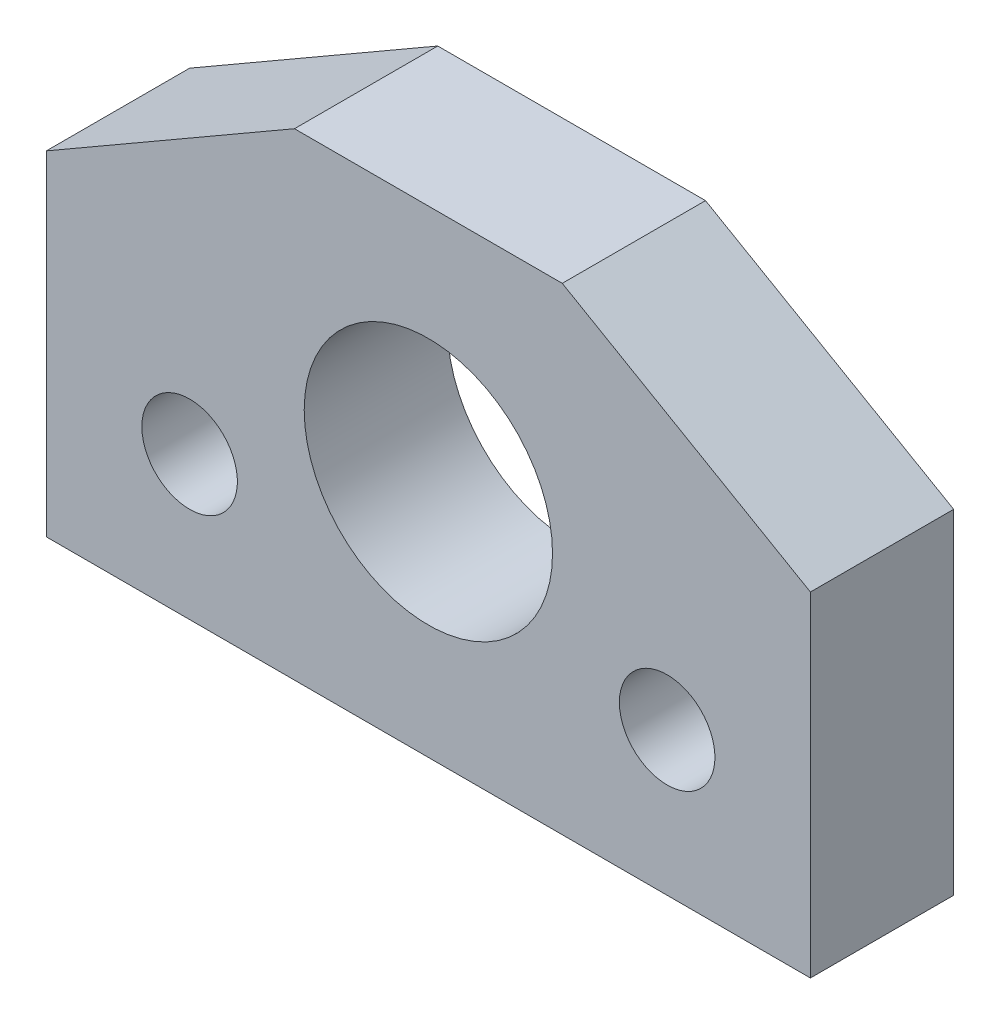
ISO-10303-21;
HEADER;
FILE_DESCRIPTION(('STEP AP214'),'2;1');
FILE_NAME('part.step','',(''),(''),'','','');
FILE_SCHEMA(('AUTOMOTIVE_DESIGN { 1 0 10303 214 1 1 1 1 }'));
ENDSEC;
DATA;
#1=APPLICATION_CONTEXT('core data for automotive mechanical design processes');
#2=APPLICATION_PROTOCOL_DEFINITION('international standard','automotive_design',2000,#1);
#3=PRODUCT_CONTEXT('',#1,'mechanical');
#4=PRODUCT('Part','Part','',(#3));
#5=PRODUCT_RELATED_PRODUCT_CATEGORY('part','',(#4));
#6=PRODUCT_DEFINITION_FORMATION('','',#4);
#7=PRODUCT_DEFINITION_CONTEXT('part definition',#1,'design');
#8=PRODUCT_DEFINITION('design','',#6,#7);
#9=PRODUCT_DEFINITION_SHAPE('','',#8);
#10=(LENGTH_UNIT() NAMED_UNIT(*) SI_UNIT(.MILLI.,.METRE.));
#11=(NAMED_UNIT(*) PLANE_ANGLE_UNIT() SI_UNIT($,.RADIAN.));
#12=(NAMED_UNIT(*) SI_UNIT($,.STERADIAN.) SOLID_ANGLE_UNIT());
#13=UNCERTAINTY_MEASURE_WITH_UNIT(LENGTH_MEASURE(1.E-05),#10,'distance_accuracy_value','');
#14=(GEOMETRIC_REPRESENTATION_CONTEXT(3) GLOBAL_UNCERTAINTY_ASSIGNED_CONTEXT((#13)) GLOBAL_UNIT_ASSIGNED_CONTEXT((#10,
#11,#12)) REPRESENTATION_CONTEXT('',''));
#15=CARTESIAN_POINT('',(0.,0.,0.));
#16=DIRECTION('',(0.,0.,1.));
#17=DIRECTION('',(1.,0.,0.));
#18=AXIS2_PLACEMENT_3D('',#15,#16,#17);
#19=CARTESIAN_POINT('',(0.,44.45,19.05));
#20=DIRECTION('',(1.,0.,0.));
#21=DIRECTION('',(0.,1.,0.));
#22=AXIS2_PLACEMENT_3D('',#19,#20,#21);
#23=PLANE('',#22);
#24=DIRECTION('',(0.,-1.,0.));
#25=VECTOR('',#24,1.);
#26=CARTESIAN_POINT('',(0.,44.45,0.));
#27=LINE('',#26,#25);
#28=CARTESIAN_POINT('',(0.,44.45,0.));
#29=VERTEX_POINT('',#28);
#30=CARTESIAN_POINT('',(0.,0.,0.));
#31=VERTEX_POINT('',#30);
#32=EDGE_CURVE('E133',#29,#31,#27,.T.);
#33=ORIENTED_EDGE('',*,*,#32,.T.);
#34=DIRECTION('',(0.,0.,-1.));
#35=VECTOR('',#34,1.);
#36=CARTESIAN_POINT('',(0.,0.,19.05));
#37=LINE('',#36,#35);
#38=CARTESIAN_POINT('',(0.,0.,19.05));
#39=VERTEX_POINT('',#38);
#40=EDGE_CURVE('E11',#39,#31,#37,.T.);
#41=ORIENTED_EDGE('',*,*,#40,.F.);
#42=DIRECTION('',(0.,-1.,0.));
#43=VECTOR('',#42,1.);
#44=CARTESIAN_POINT('',(0.,44.45,19.05));
#45=LINE('',#44,#43);
#46=CARTESIAN_POINT('',(0.,44.45,19.05));
#47=VERTEX_POINT('',#46);
#48=EDGE_CURVE('E149',#47,#39,#45,.T.);
#49=ORIENTED_EDGE('',*,*,#48,.F.);
#50=DIRECTION('',(0.,0.,-1.));
#51=VECTOR('',#50,1.);
#52=CARTESIAN_POINT('',(0.,44.45,19.05));
#53=LINE('',#52,#51);
#54=EDGE_CURVE('E129',#47,#29,#53,.T.);
#55=ORIENTED_EDGE('',*,*,#54,.T.);
#56=EDGE_LOOP('',(#33,#41,#49,#55));
#57=FACE_BOUND('',#56,.T.);
#58=ADVANCED_FACE('F41',(#57),#23,.F.);
#59=CARTESIAN_POINT('',(0.,0.,19.05));
#60=DIRECTION('',(0.,1.,0.));
#61=DIRECTION('',(0.,0.,1.));
#62=AXIS2_PLACEMENT_3D('',#59,#60,#61);
#63=PLANE('',#62);
#64=DIRECTION('',(1.,0.,0.));
#65=VECTOR('',#64,1.);
#66=CARTESIAN_POINT('',(0.,0.,0.));
#67=LINE('',#66,#65);
#68=CARTESIAN_POINT('',(101.6,0.,0.));
#69=VERTEX_POINT('',#68);
#70=EDGE_CURVE('E137',#31,#69,#67,.T.);
#71=ORIENTED_EDGE('',*,*,#70,.T.);
#72=DIRECTION('',(0.,0.,-1.));
#73=VECTOR('',#72,1.);
#74=CARTESIAN_POINT('',(101.6,0.,19.05));
#75=LINE('',#74,#73);
#76=CARTESIAN_POINT('',(101.6,0.,19.05));
#77=VERTEX_POINT('',#76);
#78=EDGE_CURVE('E51',#77,#69,#75,.T.);
#79=ORIENTED_EDGE('',*,*,#78,.F.);
#80=DIRECTION('',(1.,0.,0.));
#81=VECTOR('',#80,1.);
#82=CARTESIAN_POINT('',(0.,0.,19.05));
#83=LINE('',#82,#81);
#84=EDGE_CURVE('E97',#39,#77,#83,.T.);
#85=ORIENTED_EDGE('',*,*,#84,.F.);
#86=ORIENTED_EDGE('',*,*,#40,.T.);
#87=EDGE_LOOP('',(#71,#79,#85,#86));
#88=FACE_BOUND('',#87,.T.);
#89=ADVANCED_FACE('F200',(#88),#63,.F.);
#90=CARTESIAN_POINT('',(101.6,0.,19.05));
#91=DIRECTION('',(-1.,0.,0.));
#92=DIRECTION('',(0.,0.,1.));
#93=AXIS2_PLACEMENT_3D('',#90,#91,#92);
#94=PLANE('',#93);
#95=DIRECTION('',(0.,1.,0.));
#96=VECTOR('',#95,1.);
#97=CARTESIAN_POINT('',(101.6,0.,0.));
#98=LINE('',#97,#96);
#99=CARTESIAN_POINT('',(101.6,44.45,0.));
#100=VERTEX_POINT('',#99);
#101=EDGE_CURVE('E140',#69,#100,#98,.T.);
#102=ORIENTED_EDGE('',*,*,#101,.T.);
#103=DIRECTION('',(0.,0.,-1.));
#104=VECTOR('',#103,1.);
#105=CARTESIAN_POINT('',(101.6,44.45,19.05));
#106=LINE('',#105,#104);
#107=CARTESIAN_POINT('',(101.6,44.45,19.05));
#108=VERTEX_POINT('',#107);
#109=EDGE_CURVE('E121',#108,#100,#106,.T.);
#110=ORIENTED_EDGE('',*,*,#109,.F.);
#111=DIRECTION('',(0.,1.,0.));
#112=VECTOR('',#111,1.);
#113=CARTESIAN_POINT('',(101.6,0.,19.05));
#114=LINE('',#113,#112);
#115=EDGE_CURVE('E110',#77,#108,#114,.T.);
#116=ORIENTED_EDGE('',*,*,#115,.F.);
#117=ORIENTED_EDGE('',*,*,#78,.T.);
#118=EDGE_LOOP('',(#102,#110,#116,#117));
#119=FACE_BOUND('',#118,.T.);
#120=ADVANCED_FACE('F204',(#119),#94,.F.);
#121=CARTESIAN_POINT('',(101.6,44.45,19.05));
#122=DIRECTION('',(-0.5,-0.866025403784439,0.));
#123=DIRECTION('',(0.866025403784439,-0.5,0.));
#124=AXIS2_PLACEMENT_3D('',#121,#122,#123);
#125=PLANE('',#124);
#126=DIRECTION('',(-0.866025403784439,0.5,0.));
#127=VECTOR('',#126,1.);
#128=CARTESIAN_POINT('',(101.6,44.45,0.));
#129=LINE('',#128,#127);
#130=CARTESIAN_POINT('',(68.6044321158129,63.5,0.));
#131=VERTEX_POINT('',#130);
#132=EDGE_CURVE('E119',#100,#131,#129,.T.);
#133=ORIENTED_EDGE('',*,*,#132,.T.);
#134=DIRECTION('',(0.,0.,-1.));
#135=VECTOR('',#134,1.);
#136=CARTESIAN_POINT('',(68.6044321158129,63.5,19.05));
#137=LINE('',#136,#135);
#138=CARTESIAN_POINT('',(68.6044321158129,63.5,19.05));
#139=VERTEX_POINT('',#138);
#140=EDGE_CURVE('E116',#139,#131,#137,.T.);
#141=ORIENTED_EDGE('',*,*,#140,.F.);
#142=DIRECTION('',(-0.866025403784439,0.5,0.));
#143=VECTOR('',#142,1.);
#144=CARTESIAN_POINT('',(101.6,44.45,19.05));
#145=LINE('',#144,#143);
#146=EDGE_CURVE('E104',#108,#139,#145,.T.);
#147=ORIENTED_EDGE('',*,*,#146,.F.);
#148=ORIENTED_EDGE('',*,*,#109,.T.);
#149=EDGE_LOOP('',(#133,#141,#147,#148));
#150=FACE_BOUND('',#149,.T.);
#151=ADVANCED_FACE('F117',(#150),#125,.F.);
#152=CARTESIAN_POINT('',(68.6044321158129,63.5,19.05));
#153=DIRECTION('',(0.,-1.,0.));
#154=DIRECTION('',(1.,0.,0.));
#155=AXIS2_PLACEMENT_3D('',#152,#153,#154);
#156=PLANE('',#155);
#157=DIRECTION('',(-1.,0.,0.));
#158=VECTOR('',#157,1.);
#159=CARTESIAN_POINT('',(68.6044321158129,63.5,0.));
#160=LINE('',#159,#158);
#161=CARTESIAN_POINT('',(32.9955678841871,63.5,0.));
#162=VERTEX_POINT('',#161);
#163=EDGE_CURVE('E83',#131,#162,#160,.T.);
#164=ORIENTED_EDGE('',*,*,#163,.T.);
#165=DIRECTION('',(0.,0.,-1.));
#166=VECTOR('',#165,1.);
#167=CARTESIAN_POINT('',(32.9955678841871,63.5,19.05));
#168=LINE('',#167,#166);
#169=CARTESIAN_POINT('',(32.9955678841871,63.5,19.05));
#170=VERTEX_POINT('',#169);
#171=EDGE_CURVE('E122',#170,#162,#168,.T.);
#172=ORIENTED_EDGE('',*,*,#171,.F.);
#173=DIRECTION('',(-1.,0.,0.));
#174=VECTOR('',#173,1.);
#175=CARTESIAN_POINT('',(68.6044321158129,63.5,19.05));
#176=LINE('',#175,#174);
#177=EDGE_CURVE('E108',#139,#170,#176,.T.);
#178=ORIENTED_EDGE('',*,*,#177,.F.);
#179=ORIENTED_EDGE('',*,*,#140,.T.);
#180=EDGE_LOOP('',(#164,#172,#178,#179));
#181=FACE_BOUND('',#180,.T.);
#182=ADVANCED_FACE('F124',(#181),#156,.F.);
#183=CARTESIAN_POINT('',(32.9955678841871,63.5,19.05));
#184=DIRECTION('',(0.499999999999999,-0.866025403784439,0.));
#185=DIRECTION('',(0.866025403784439,0.5,0.));
#186=AXIS2_PLACEMENT_3D('',#183,#184,#185);
#187=PLANE('',#186);
#188=DIRECTION('',(-0.866025403784439,-0.499999999999999,0.));
#189=VECTOR('',#188,1.);
#190=CARTESIAN_POINT('',(32.9955678841871,63.5,0.));
#191=LINE('',#190,#189);
#192=EDGE_CURVE('E89',#162,#29,#191,.T.);
#193=ORIENTED_EDGE('',*,*,#192,.T.);
#194=ORIENTED_EDGE('',*,*,#54,.F.);
#195=DIRECTION('',(-0.866025403784439,-0.499999999999999,0.));
#196=VECTOR('',#195,1.);
#197=CARTESIAN_POINT('',(32.9955678841871,63.5,19.05));
#198=LINE('',#197,#196);
#199=EDGE_CURVE('E60',#170,#47,#198,.T.);
#200=ORIENTED_EDGE('',*,*,#199,.F.);
#201=ORIENTED_EDGE('',*,*,#171,.T.);
#202=EDGE_LOOP('',(#193,#194,#200,#201));
#203=FACE_BOUND('',#202,.T.);
#204=ADVANCED_FACE('F189',(#203),#187,.F.);
#205=CARTESIAN_POINT('',(0.,0.,19.05));
#206=DIRECTION('',(0.,0.,1.));
#207=DIRECTION('',(1.,0.,0.));
#208=AXIS2_PLACEMENT_3D('',#205,#206,#207);
#209=PLANE('',#208);
#210=CARTESIAN_POINT('',(19.05,19.05,19.05));
#211=DIRECTION('',(0.,0.,1.));
#212=DIRECTION('',(1.,0.,0.));
#213=AXIS2_PLACEMENT_3D('',#210,#211,#212);
#214=CIRCLE('',#213,6.35);
#215=CARTESIAN_POINT('',(12.7,19.05,19.05));
#216=VERTEX_POINT('',#215);
#217=EDGE_CURVE('E163',#216,#216,#214,.T.);
#218=ORIENTED_EDGE('',*,*,#217,.F.);
#219=EDGE_LOOP('',(#218));
#220=FACE_BOUND('',#219,.T.);
#221=CARTESIAN_POINT('',(82.55,19.05,19.05));
#222=DIRECTION('',(0.,0.,1.));
#223=DIRECTION('',(1.,0.,0.));
#224=AXIS2_PLACEMENT_3D('',#221,#222,#223);
#225=CIRCLE('',#224,6.35);
#226=CARTESIAN_POINT('',(76.2,19.05,19.05));
#227=VERTEX_POINT('',#226);
#228=EDGE_CURVE('E307',#227,#227,#225,.T.);
#229=ORIENTED_EDGE('',*,*,#228,.F.);
#230=EDGE_LOOP('',(#229));
#231=FACE_BOUND('',#230,.T.);
#232=CARTESIAN_POINT('',(50.8,31.75,19.05));
#233=DIRECTION('',(0.,0.,1.));
#234=DIRECTION('',(1.,0.,0.));
#235=AXIS2_PLACEMENT_3D('',#232,#233,#234);
#236=CIRCLE('',#235,16.51);
#237=CARTESIAN_POINT('',(34.29,31.75,19.05));
#238=VERTEX_POINT('',#237);
#239=EDGE_CURVE('E312',#238,#238,#236,.T.);
#240=ORIENTED_EDGE('',*,*,#239,.F.);
#241=EDGE_LOOP('',(#240));
#242=FACE_BOUND('',#241,.T.);
#243=ORIENTED_EDGE('',*,*,#48,.T.);
#244=ORIENTED_EDGE('',*,*,#84,.T.);
#245=ORIENTED_EDGE('',*,*,#115,.T.);
#246=ORIENTED_EDGE('',*,*,#146,.T.);
#247=ORIENTED_EDGE('',*,*,#177,.T.);
#248=ORIENTED_EDGE('',*,*,#199,.T.);
#249=EDGE_LOOP('',(#243,#244,#245,#246,#247,#248));
#250=FACE_BOUND('',#249,.T.);
#251=ADVANCED_FACE('F106',(#220,#231,#242,#250),#209,.T.);
#252=CARTESIAN_POINT('',(0.,0.,0.));
#253=DIRECTION('',(0.,0.,1.));
#254=DIRECTION('',(1.,0.,0.));
#255=AXIS2_PLACEMENT_3D('',#252,#253,#254);
#256=PLANE('',#255);
#257=CARTESIAN_POINT('',(19.05,19.05,0.));
#258=DIRECTION('',(0.,0.,1.));
#259=DIRECTION('',(1.,0.,0.));
#260=AXIS2_PLACEMENT_3D('',#257,#258,#259);
#261=CIRCLE('',#260,6.35);
#262=CARTESIAN_POINT('',(12.7,19.05,0.));
#263=VERTEX_POINT('',#262);
#264=EDGE_CURVE('E44',#263,#263,#261,.F.);
#265=ORIENTED_EDGE('',*,*,#264,.F.);
#266=EDGE_LOOP('',(#265));
#267=FACE_BOUND('',#266,.T.);
#268=CARTESIAN_POINT('',(82.55,19.05,0.));
#269=DIRECTION('',(0.,0.,1.));
#270=DIRECTION('',(1.,0.,0.));
#271=AXIS2_PLACEMENT_3D('',#268,#269,#270);
#272=CIRCLE('',#271,6.35);
#273=CARTESIAN_POINT('',(76.2,19.05,0.));
#274=VERTEX_POINT('',#273);
#275=EDGE_CURVE('E162',#274,#274,#272,.F.);
#276=ORIENTED_EDGE('',*,*,#275,.F.);
#277=EDGE_LOOP('',(#276));
#278=FACE_BOUND('',#277,.T.);
#279=CARTESIAN_POINT('',(50.8,31.75,0.));
#280=DIRECTION('',(0.,0.,1.));
#281=DIRECTION('',(1.,0.,0.));
#282=AXIS2_PLACEMENT_3D('',#279,#280,#281);
#283=CIRCLE('',#282,16.51);
#284=CARTESIAN_POINT('',(34.29,31.75,0.));
#285=VERTEX_POINT('',#284);
#286=EDGE_CURVE('E159',#285,#285,#283,.F.);
#287=ORIENTED_EDGE('',*,*,#286,.F.);
#288=EDGE_LOOP('',(#287));
#289=FACE_BOUND('',#288,.T.);
#290=ORIENTED_EDGE('',*,*,#32,.F.);
#291=ORIENTED_EDGE('',*,*,#192,.F.);
#292=ORIENTED_EDGE('',*,*,#163,.F.);
#293=ORIENTED_EDGE('',*,*,#132,.F.);
#294=ORIENTED_EDGE('',*,*,#101,.F.);
#295=ORIENTED_EDGE('',*,*,#70,.F.);
#296=EDGE_LOOP('',(#290,#291,#292,#293,#294,#295));
#297=FACE_BOUND('',#296,.T.);
#298=ADVANCED_FACE('F176',(#267,#278,#289,#297),#256,.F.);
#299=CARTESIAN_POINT('',(50.8,31.75,19.05));
#300=DIRECTION('',(0.,0.,-1.));
#301=DIRECTION('',(-1.,0.,0.));
#302=AXIS2_PLACEMENT_3D('',#299,#300,#301);
#303=CYLINDRICAL_SURFACE('',#302,16.51);
#304=CARTESIAN_POINT('',(34.29,31.75,19.05));
#305=CARTESIAN_POINT('',(34.29,31.75,18.8515625));
#306=CARTESIAN_POINT('',(34.29,31.75,18.653125));
#307=CARTESIAN_POINT('',(34.29,31.75,18.25625));
#308=CARTESIAN_POINT('',(34.29,31.75,18.0578125));
#309=CARTESIAN_POINT('',(34.29,31.75,17.6609375));
#310=CARTESIAN_POINT('',(34.29,31.75,17.4625));
#311=CARTESIAN_POINT('',(34.29,31.75,17.065625));
#312=CARTESIAN_POINT('',(34.29,31.75,16.8671875));
#313=CARTESIAN_POINT('',(34.29,31.75,16.4703125));
#314=CARTESIAN_POINT('',(34.29,31.75,16.271875));
#315=CARTESIAN_POINT('',(34.29,31.75,15.875));
#316=CARTESIAN_POINT('',(34.29,31.75,15.6765625));
#317=CARTESIAN_POINT('',(34.29,31.75,15.2796875));
#318=CARTESIAN_POINT('',(34.29,31.75,15.08125));
#319=CARTESIAN_POINT('',(34.29,31.75,14.684375));
#320=CARTESIAN_POINT('',(34.29,31.75,14.4859375));
#321=CARTESIAN_POINT('',(34.29,31.75,14.0890625));
#322=CARTESIAN_POINT('',(34.29,31.75,13.890625));
#323=CARTESIAN_POINT('',(34.29,31.75,13.49375));
#324=CARTESIAN_POINT('',(34.29,31.75,13.2953125));
#325=CARTESIAN_POINT('',(34.29,31.75,12.8984375));
#326=CARTESIAN_POINT('',(34.29,31.75,12.7));
#327=CARTESIAN_POINT('',(34.29,31.75,12.303125));
#328=CARTESIAN_POINT('',(34.29,31.75,12.1046875));
#329=CARTESIAN_POINT('',(34.29,31.75,11.7078125));
#330=CARTESIAN_POINT('',(34.29,31.75,11.509375));
#331=CARTESIAN_POINT('',(34.29,31.75,11.1125));
#332=CARTESIAN_POINT('',(34.29,31.75,10.9140625));
#333=CARTESIAN_POINT('',(34.29,31.75,10.5171875));
#334=CARTESIAN_POINT('',(34.29,31.75,10.31875));
#335=CARTESIAN_POINT('',(34.29,31.75,9.921875));
#336=CARTESIAN_POINT('',(34.29,31.75,9.7234375));
#337=CARTESIAN_POINT('',(34.29,31.75,9.3265625));
#338=CARTESIAN_POINT('',(34.29,31.75,9.128125));
#339=CARTESIAN_POINT('',(34.29,31.75,8.73125));
#340=CARTESIAN_POINT('',(34.29,31.75,8.5328125));
#341=CARTESIAN_POINT('',(34.29,31.75,8.1359375));
#342=CARTESIAN_POINT('',(34.29,31.75,7.9375));
#343=CARTESIAN_POINT('',(34.29,31.75,7.540625));
#344=CARTESIAN_POINT('',(34.29,31.75,7.3421875));
#345=CARTESIAN_POINT('',(34.29,31.75,6.9453125));
#346=CARTESIAN_POINT('',(34.29,31.75,6.746875));
#347=CARTESIAN_POINT('',(34.29,31.75,6.35));
#348=CARTESIAN_POINT('',(34.29,31.75,6.1515625));
#349=CARTESIAN_POINT('',(34.29,31.75,5.7546875));
#350=CARTESIAN_POINT('',(34.29,31.75,5.55625));
#351=CARTESIAN_POINT('',(34.29,31.75,5.159375));
#352=CARTESIAN_POINT('',(34.29,31.75,4.9609375));
#353=CARTESIAN_POINT('',(34.29,31.75,4.5640625));
#354=CARTESIAN_POINT('',(34.29,31.75,4.365625));
#355=CARTESIAN_POINT('',(34.29,31.75,3.96875));
#356=CARTESIAN_POINT('',(34.29,31.75,3.7703125));
#357=CARTESIAN_POINT('',(34.29,31.75,3.3734375));
#358=CARTESIAN_POINT('',(34.29,31.75,3.175));
#359=CARTESIAN_POINT('',(34.29,31.75,2.778125));
#360=CARTESIAN_POINT('',(34.29,31.75,2.5796875));
#361=CARTESIAN_POINT('',(34.29,31.75,2.1828125));
#362=CARTESIAN_POINT('',(34.29,31.75,1.984375));
#363=CARTESIAN_POINT('',(34.29,31.75,1.5875));
#364=CARTESIAN_POINT('',(34.29,31.75,1.3890625));
#365=CARTESIAN_POINT('',(34.29,31.75,0.992187500000001));
#366=CARTESIAN_POINT('',(34.29,31.75,0.793750000000001));
#367=CARTESIAN_POINT('',(34.29,31.75,0.396875));
#368=CARTESIAN_POINT('',(34.29,31.75,0.1984375));
#369=CARTESIAN_POINT('',(34.29,31.75,0.));
#370=B_SPLINE_CURVE_WITH_KNOTS('',3,(#304,#305,#306,#307,#308,#309,#310,#311,#312,#313,#314,
#315,#316,#317,#318,#319,#320,#321,#322,#323,#324,#325,#326,#327,#328,#329,#330,#331,#332,#333,
#334,#335,#336,#337,#338,#339,#340,#341,#342,#343,#344,#345,#346,#347,#348,#349,#350,#351,#352,
#353,#354,#355,#356,#357,#358,#359,#360,#361,#362,#363,#364,#365,#366,#367,#368,#369),
.UNSPECIFIED.,.F.,.F.,(4,2,2,2,2,2,2,2,2,2,2,2,2,2,2,2,2,2,2,2,2,2,2,2,2,2,2,2,2,2,2,2,4),(0.,
0.595312499999997,1.190625,1.7859375,2.38125,2.9765625,3.571875,4.1671875,4.7625,5.3578125,
5.953125,6.5484375,7.14375,7.7390625,8.334375,8.9296875,9.525,10.1203125,10.715625,11.3109375,
11.90625,12.5015625,13.096875,13.6921875,14.2875,14.8828125,15.478125,16.0734375,16.66875,
17.2640625,17.859375,18.4546875,19.05),.UNSPECIFIED.);
#371=EDGE_CURVE('BSEAM179',#238,#285,#370,.T.);
#372=ORIENTED_EDGE('',*,*,#239,.T.);
#373=ORIENTED_EDGE('',*,*,#286,.T.);
#374=ORIENTED_EDGE('',*,*,#371,.T.);
#375=ORIENTED_EDGE('',*,*,#371,.F.);
#376=EDGE_LOOP('',(#372,#374,#373,#375));
#377=FACE_BOUND('',#376,.T.);
#378=ADVANCED_FACE('F179',(#377),#303,.F.);
#379=CARTESIAN_POINT('',(82.55,19.05,19.05));
#380=DIRECTION('',(0.,0.,-1.));
#381=DIRECTION('',(-1.,0.,0.));
#382=AXIS2_PLACEMENT_3D('',#379,#380,#381);
#383=CYLINDRICAL_SURFACE('',#382,6.35);
#384=CARTESIAN_POINT('',(76.2,19.05,19.05));
#385=CARTESIAN_POINT('',(76.2,19.05,18.8515625));
#386=CARTESIAN_POINT('',(76.2,19.05,18.653125));
#387=CARTESIAN_POINT('',(76.2,19.05,18.25625));
#388=CARTESIAN_POINT('',(76.2,19.05,18.0578125));
#389=CARTESIAN_POINT('',(76.2,19.05,17.6609375));
#390=CARTESIAN_POINT('',(76.2,19.05,17.4625));
#391=CARTESIAN_POINT('',(76.2,19.05,17.065625));
#392=CARTESIAN_POINT('',(76.2,19.05,16.8671875));
#393=CARTESIAN_POINT('',(76.2,19.05,16.4703125));
#394=CARTESIAN_POINT('',(76.2,19.05,16.271875));
#395=CARTESIAN_POINT('',(76.2,19.05,15.875));
#396=CARTESIAN_POINT('',(76.2,19.05,15.6765625));
#397=CARTESIAN_POINT('',(76.2,19.05,15.2796875));
#398=CARTESIAN_POINT('',(76.2,19.05,15.08125));
#399=CARTESIAN_POINT('',(76.2,19.05,14.684375));
#400=CARTESIAN_POINT('',(76.2,19.05,14.4859375));
#401=CARTESIAN_POINT('',(76.2,19.05,14.0890625));
#402=CARTESIAN_POINT('',(76.2,19.05,13.890625));
#403=CARTESIAN_POINT('',(76.2,19.05,13.49375));
#404=CARTESIAN_POINT('',(76.2,19.05,13.2953125));
#405=CARTESIAN_POINT('',(76.2,19.05,12.8984375));
#406=CARTESIAN_POINT('',(76.2,19.05,12.7));
#407=CARTESIAN_POINT('',(76.2,19.05,12.303125));
#408=CARTESIAN_POINT('',(76.2,19.05,12.1046875));
#409=CARTESIAN_POINT('',(76.2,19.05,11.7078125));
#410=CARTESIAN_POINT('',(76.2,19.05,11.509375));
#411=CARTESIAN_POINT('',(76.2,19.05,11.1125));
#412=CARTESIAN_POINT('',(76.2,19.05,10.9140625));
#413=CARTESIAN_POINT('',(76.2,19.05,10.5171875));
#414=CARTESIAN_POINT('',(76.2,19.05,10.31875));
#415=CARTESIAN_POINT('',(76.2,19.05,9.921875));
#416=CARTESIAN_POINT('',(76.2,19.05,9.7234375));
#417=CARTESIAN_POINT('',(76.2,19.05,9.3265625));
#418=CARTESIAN_POINT('',(76.2,19.05,9.128125));
#419=CARTESIAN_POINT('',(76.2,19.05,8.73125));
#420=CARTESIAN_POINT('',(76.2,19.05,8.5328125));
#421=CARTESIAN_POINT('',(76.2,19.05,8.1359375));
#422=CARTESIAN_POINT('',(76.2,19.05,7.9375));
#423=CARTESIAN_POINT('',(76.2,19.05,7.540625));
#424=CARTESIAN_POINT('',(76.2,19.05,7.3421875));
#425=CARTESIAN_POINT('',(76.2,19.05,6.9453125));
#426=CARTESIAN_POINT('',(76.2,19.05,6.746875));
#427=CARTESIAN_POINT('',(76.2,19.05,6.35));
#428=CARTESIAN_POINT('',(76.2,19.05,6.1515625));
#429=CARTESIAN_POINT('',(76.2,19.05,5.7546875));
#430=CARTESIAN_POINT('',(76.2,19.05,5.55625));
#431=CARTESIAN_POINT('',(76.2,19.05,5.159375));
#432=CARTESIAN_POINT('',(76.2,19.05,4.9609375));
#433=CARTESIAN_POINT('',(76.2,19.05,4.5640625));
#434=CARTESIAN_POINT('',(76.2,19.05,4.365625));
#435=CARTESIAN_POINT('',(76.2,19.05,3.96875));
#436=CARTESIAN_POINT('',(76.2,19.05,3.7703125));
#437=CARTESIAN_POINT('',(76.2,19.05,3.3734375));
#438=CARTESIAN_POINT('',(76.2,19.05,3.175));
#439=CARTESIAN_POINT('',(76.2,19.05,2.778125));
#440=CARTESIAN_POINT('',(76.2,19.05,2.5796875));
#441=CARTESIAN_POINT('',(76.2,19.05,2.1828125));
#442=CARTESIAN_POINT('',(76.2,19.05,1.984375));
#443=CARTESIAN_POINT('',(76.2,19.05,1.5875));
#444=CARTESIAN_POINT('',(76.2,19.05,1.3890625));
#445=CARTESIAN_POINT('',(76.2,19.05,0.992187500000001));
#446=CARTESIAN_POINT('',(76.2,19.05,0.793750000000001));
#447=CARTESIAN_POINT('',(76.2,19.05,0.396875));
#448=CARTESIAN_POINT('',(76.2,19.05,0.1984375));
#449=CARTESIAN_POINT('',(76.2,19.05,0.));
#450=B_SPLINE_CURVE_WITH_KNOTS('',3,(#384,#385,#386,#387,#388,#389,#390,#391,#392,#393,#394,
#395,#396,#397,#398,#399,#400,#401,#402,#403,#404,#405,#406,#407,#408,#409,#410,#411,#412,#413,
#414,#415,#416,#417,#418,#419,#420,#421,#422,#423,#424,#425,#426,#427,#428,#429,#430,#431,#432,
#433,#434,#435,#436,#437,#438,#439,#440,#441,#442,#443,#444,#445,#446,#447,#448,#449),
.UNSPECIFIED.,.F.,.F.,(4,2,2,2,2,2,2,2,2,2,2,2,2,2,2,2,2,2,2,2,2,2,2,2,2,2,2,2,2,2,2,2,4),(0.,
0.5953125,1.190625,1.7859375,2.38125,2.9765625,3.571875,4.1671875,4.7625,5.3578125,5.953125,
6.5484375,7.14375,7.7390625,8.334375,8.9296875,9.525,10.1203125,10.715625,11.3109375,11.90625,
12.5015625,13.096875,13.6921875,14.2875,14.8828125,15.478125,16.0734375,16.66875,17.2640625,
17.859375,18.4546875,19.05),.UNSPECIFIED.);
#451=EDGE_CURVE('BSEAM245',#227,#274,#450,.T.);
#452=ORIENTED_EDGE('',*,*,#228,.T.);
#453=ORIENTED_EDGE('',*,*,#275,.T.);
#454=ORIENTED_EDGE('',*,*,#451,.T.);
#455=ORIENTED_EDGE('',*,*,#451,.F.);
#456=EDGE_LOOP('',(#452,#454,#453,#455));
#457=FACE_BOUND('',#456,.T.);
#458=ADVANCED_FACE('F245',(#457),#383,.F.);
#459=CARTESIAN_POINT('',(19.05,19.05,19.05));
#460=DIRECTION('',(0.,0.,-1.));
#461=DIRECTION('',(-1.,0.,0.));
#462=AXIS2_PLACEMENT_3D('',#459,#460,#461);
#463=CYLINDRICAL_SURFACE('',#462,6.35);
#464=CARTESIAN_POINT('',(12.7,19.05,19.05));
#465=CARTESIAN_POINT('',(12.7,19.05,18.8515625));
#466=CARTESIAN_POINT('',(12.7,19.05,18.653125));
#467=CARTESIAN_POINT('',(12.7,19.05,18.25625));
#468=CARTESIAN_POINT('',(12.7,19.05,18.0578125));
#469=CARTESIAN_POINT('',(12.7,19.05,17.6609375));
#470=CARTESIAN_POINT('',(12.7,19.05,17.4625));
#471=CARTESIAN_POINT('',(12.7,19.05,17.065625));
#472=CARTESIAN_POINT('',(12.7,19.05,16.8671875));
#473=CARTESIAN_POINT('',(12.7,19.05,16.4703125));
#474=CARTESIAN_POINT('',(12.7,19.05,16.271875));
#475=CARTESIAN_POINT('',(12.7,19.05,15.875));
#476=CARTESIAN_POINT('',(12.7,19.05,15.6765625));
#477=CARTESIAN_POINT('',(12.7,19.05,15.2796875));
#478=CARTESIAN_POINT('',(12.7,19.05,15.08125));
#479=CARTESIAN_POINT('',(12.7,19.05,14.684375));
#480=CARTESIAN_POINT('',(12.7,19.05,14.4859375));
#481=CARTESIAN_POINT('',(12.7,19.05,14.0890625));
#482=CARTESIAN_POINT('',(12.7,19.05,13.890625));
#483=CARTESIAN_POINT('',(12.7,19.05,13.49375));
#484=CARTESIAN_POINT('',(12.7,19.05,13.2953125));
#485=CARTESIAN_POINT('',(12.7,19.05,12.8984375));
#486=CARTESIAN_POINT('',(12.7,19.05,12.7));
#487=CARTESIAN_POINT('',(12.7,19.05,12.303125));
#488=CARTESIAN_POINT('',(12.7,19.05,12.1046875));
#489=CARTESIAN_POINT('',(12.7,19.05,11.7078125));
#490=CARTESIAN_POINT('',(12.7,19.05,11.509375));
#491=CARTESIAN_POINT('',(12.7,19.05,11.1125));
#492=CARTESIAN_POINT('',(12.7,19.05,10.9140625));
#493=CARTESIAN_POINT('',(12.7,19.05,10.5171875));
#494=CARTESIAN_POINT('',(12.7,19.05,10.31875));
#495=CARTESIAN_POINT('',(12.7,19.05,9.921875));
#496=CARTESIAN_POINT('',(12.7,19.05,9.7234375));
#497=CARTESIAN_POINT('',(12.7,19.05,9.3265625));
#498=CARTESIAN_POINT('',(12.7,19.05,9.128125));
#499=CARTESIAN_POINT('',(12.7,19.05,8.73125));
#500=CARTESIAN_POINT('',(12.7,19.05,8.5328125));
#501=CARTESIAN_POINT('',(12.7,19.05,8.1359375));
#502=CARTESIAN_POINT('',(12.7,19.05,7.9375));
#503=CARTESIAN_POINT('',(12.7,19.05,7.540625));
#504=CARTESIAN_POINT('',(12.7,19.05,7.3421875));
#505=CARTESIAN_POINT('',(12.7,19.05,6.9453125));
#506=CARTESIAN_POINT('',(12.7,19.05,6.746875));
#507=CARTESIAN_POINT('',(12.7,19.05,6.35));
#508=CARTESIAN_POINT('',(12.7,19.05,6.1515625));
#509=CARTESIAN_POINT('',(12.7,19.05,5.7546875));
#510=CARTESIAN_POINT('',(12.7,19.05,5.55625));
#511=CARTESIAN_POINT('',(12.7,19.05,5.159375));
#512=CARTESIAN_POINT('',(12.7,19.05,4.9609375));
#513=CARTESIAN_POINT('',(12.7,19.05,4.5640625));
#514=CARTESIAN_POINT('',(12.7,19.05,4.365625));
#515=CARTESIAN_POINT('',(12.7,19.05,3.96875));
#516=CARTESIAN_POINT('',(12.7,19.05,3.7703125));
#517=CARTESIAN_POINT('',(12.7,19.05,3.3734375));
#518=CARTESIAN_POINT('',(12.7,19.05,3.175));
#519=CARTESIAN_POINT('',(12.7,19.05,2.778125));
#520=CARTESIAN_POINT('',(12.7,19.05,2.5796875));
#521=CARTESIAN_POINT('',(12.7,19.05,2.1828125));
#522=CARTESIAN_POINT('',(12.7,19.05,1.984375));
#523=CARTESIAN_POINT('',(12.7,19.05,1.5875));
#524=CARTESIAN_POINT('',(12.7,19.05,1.3890625));
#525=CARTESIAN_POINT('',(12.7,19.05,0.992187500000001));
#526=CARTESIAN_POINT('',(12.7,19.05,0.793750000000001));
#527=CARTESIAN_POINT('',(12.7,19.05,0.396875));
#528=CARTESIAN_POINT('',(12.7,19.05,0.1984375));
#529=CARTESIAN_POINT('',(12.7,19.05,0.));
#530=B_SPLINE_CURVE_WITH_KNOTS('',3,(#464,#465,#466,#467,#468,#469,#470,#471,#472,#473,#474,
#475,#476,#477,#478,#479,#480,#481,#482,#483,#484,#485,#486,#487,#488,#489,#490,#491,#492,#493,
#494,#495,#496,#497,#498,#499,#500,#501,#502,#503,#504,#505,#506,#507,#508,#509,#510,#511,#512,
#513,#514,#515,#516,#517,#518,#519,#520,#521,#522,#523,#524,#525,#526,#527,#528,#529),
.UNSPECIFIED.,.F.,.F.,(4,2,2,2,2,2,2,2,2,2,2,2,2,2,2,2,2,2,2,2,2,2,2,2,2,2,2,2,2,2,2,2,4),(0.,
0.5953125,1.190625,1.7859375,2.38125,2.9765625,3.571875,4.1671875,4.7625,5.3578125,5.953125,
6.5484375,7.14375,7.7390625,8.334375,8.9296875,9.525,10.1203125,10.715625,11.3109375,11.90625,
12.5015625,13.096875,13.6921875,14.2875,14.8828125,15.478125,16.0734375,16.66875,17.2640625,
17.859375,18.4546875,19.05),.UNSPECIFIED.);
#531=EDGE_CURVE('BSEAM174',#216,#263,#530,.T.);
#532=ORIENTED_EDGE('',*,*,#217,.T.);
#533=ORIENTED_EDGE('',*,*,#264,.T.);
#534=ORIENTED_EDGE('',*,*,#531,.T.);
#535=ORIENTED_EDGE('',*,*,#531,.F.);
#536=EDGE_LOOP('',(#532,#534,#533,#535));
#537=FACE_BOUND('',#536,.T.);
#538=ADVANCED_FACE('F174',(#537),#463,.F.);
#539=CLOSED_SHELL('',(#58,#89,#120,#151,#182,#204,#251,#298,#378,#458,#538));
#540=MANIFOLD_SOLID_BREP('B2',#539);
#541=ADVANCED_BREP_SHAPE_REPRESENTATION('',(#18,#540),#14);
#542=SHAPE_DEFINITION_REPRESENTATION(#9,#541);
ENDSEC;
END-ISO-10303-21;
